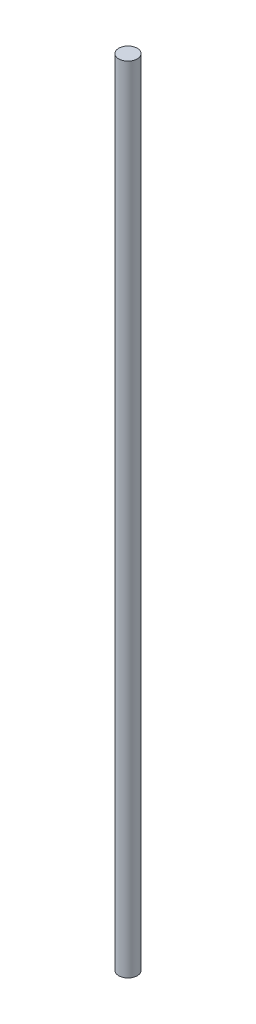
ISO-10303-21;
HEADER;
FILE_DESCRIPTION(('STEP AP214'),'2;1');
FILE_NAME('part.step','',(''),(''),'','','');
FILE_SCHEMA(('AUTOMOTIVE_DESIGN { 1 0 10303 214 1 1 1 1 }'));
ENDSEC;
DATA;
#1=APPLICATION_CONTEXT('core data for automotive mechanical design processes');
#2=APPLICATION_PROTOCOL_DEFINITION('international standard','automotive_design',2000,#1);
#3=PRODUCT_CONTEXT('',#1,'mechanical');
#4=PRODUCT('Part','Part','',(#3));
#5=PRODUCT_RELATED_PRODUCT_CATEGORY('part','',(#4));
#6=PRODUCT_DEFINITION_FORMATION('','',#4);
#7=PRODUCT_DEFINITION_CONTEXT('part definition',#1,'design');
#8=PRODUCT_DEFINITION('design','',#6,#7);
#9=PRODUCT_DEFINITION_SHAPE('','',#8);
#10=(LENGTH_UNIT() NAMED_UNIT(*) SI_UNIT(.MILLI.,.METRE.));
#11=(NAMED_UNIT(*) PLANE_ANGLE_UNIT() SI_UNIT($,.RADIAN.));
#12=(NAMED_UNIT(*) SI_UNIT($,.STERADIAN.) SOLID_ANGLE_UNIT());
#13=UNCERTAINTY_MEASURE_WITH_UNIT(LENGTH_MEASURE(1.E-05),#10,'distance_accuracy_value','');
#14=(GEOMETRIC_REPRESENTATION_CONTEXT(3) GLOBAL_UNCERTAINTY_ASSIGNED_CONTEXT((#13)) GLOBAL_UNIT_ASSIGNED_CONTEXT((#10,
#11,#12)) REPRESENTATION_CONTEXT('',''));
#15=CARTESIAN_POINT('',(0.,0.,0.));
#16=DIRECTION('',(0.,0.,1.));
#17=DIRECTION('',(1.,0.,0.));
#18=AXIS2_PLACEMENT_3D('',#15,#16,#17);
#19=CARTESIAN_POINT('',(0.,300.,0.));
#20=DIRECTION('',(0.,-1.,0.));
#21=DIRECTION('',(0.,0.,-1.));
#22=AXIS2_PLACEMENT_3D('',#19,#20,#21);
#23=CYLINDRICAL_SURFACE('',#22,3.5);
#24=CARTESIAN_POINT('',(0.,300.,0.));
#25=DIRECTION('',(0.,1.,0.));
#26=DIRECTION('',(0.,0.,1.));
#27=AXIS2_PLACEMENT_3D('',#24,#25,#26);
#28=CIRCLE('',#27,3.5);
#29=CARTESIAN_POINT('',(0.,300.,3.5));
#30=VERTEX_POINT('',#29);
#31=EDGE_CURVE('E10',#30,#30,#28,.T.);
#32=ORIENTED_EDGE('',*,*,#31,.F.);
#33=EDGE_LOOP('',(#32));
#34=FACE_BOUND('',#33,.T.);
#35=CARTESIAN_POINT('',(0.,0.,0.));
#36=DIRECTION('',(0.,1.,0.));
#37=DIRECTION('',(0.,0.,1.));
#38=AXIS2_PLACEMENT_3D('',#35,#36,#37);
#39=CIRCLE('',#38,3.5);
#40=CARTESIAN_POINT('',(0.,0.,3.5));
#41=VERTEX_POINT('',#40);
#42=EDGE_CURVE('E34',#41,#41,#39,.T.);
#43=ORIENTED_EDGE('',*,*,#42,.T.);
#44=EDGE_LOOP('',(#43));
#45=FACE_BOUND('',#44,.T.);
#46=ADVANCED_FACE('F31',(#34,#45),#23,.T.);
#47=CARTESIAN_POINT('',(0.,300.,0.));
#48=DIRECTION('',(0.,1.,0.));
#49=DIRECTION('',(0.,0.,1.));
#50=AXIS2_PLACEMENT_3D('',#47,#48,#49);
#51=PLANE('',#50);
#52=ORIENTED_EDGE('',*,*,#31,.T.);
#53=EDGE_LOOP('',(#52));
#54=FACE_BOUND('',#53,.T.);
#55=ADVANCED_FACE('F60',(#54),#51,.T.);
#56=CARTESIAN_POINT('',(0.,0.,0.));
#57=DIRECTION('',(0.,1.,0.));
#58=DIRECTION('',(0.,0.,1.));
#59=AXIS2_PLACEMENT_3D('',#56,#57,#58);
#60=PLANE('',#59);
#61=CARTESIAN_POINT('',(0.,0.,0.));
#62=DIRECTION('',(0.,-1.,0.));
#63=DIRECTION('',(0.,0.,-1.));
#64=AXIS2_PLACEMENT_3D('',#61,#62,#63);
#65=CIRCLE('',#64,2.5);
#66=CARTESIAN_POINT('',(0.,0.,-2.5));
#67=VERTEX_POINT('',#66);
#68=EDGE_CURVE('E43',#67,#67,#65,.T.);
#69=ORIENTED_EDGE('',*,*,#68,.F.);
#70=EDGE_LOOP('',(#69));
#71=FACE_BOUND('',#70,.T.);
#72=ORIENTED_EDGE('',*,*,#42,.F.);
#73=EDGE_LOOP('',(#72));
#74=FACE_BOUND('',#73,.T.);
#75=ADVANCED_FACE('F54',(#71,#74),#60,.F.);
#76=CARTESIAN_POINT('',(0.,11.,0.));
#77=DIRECTION('',(0.,-1.,0.));
#78=DIRECTION('',(0.,0.,-1.));
#79=AXIS2_PLACEMENT_3D('',#76,#77,#78);
#80=CYLINDRICAL_SURFACE('',#79,2.5);
#81=CARTESIAN_POINT('',(0.,11.,0.));
#82=DIRECTION('',(0.,-1.,0.));
#83=DIRECTION('',(0.,0.,-1.));
#84=AXIS2_PLACEMENT_3D('',#81,#82,#83);
#85=CIRCLE('',#84,2.5);
#86=CARTESIAN_POINT('',(0.,11.,-2.5));
#87=VERTEX_POINT('',#86);
#88=EDGE_CURVE('E41',#87,#87,#85,.T.);
#89=ORIENTED_EDGE('',*,*,#88,.F.);
#90=EDGE_LOOP('',(#89));
#91=FACE_BOUND('',#90,.T.);
#92=ORIENTED_EDGE('',*,*,#68,.T.);
#93=EDGE_LOOP('',(#92));
#94=FACE_BOUND('',#93,.T.);
#95=ADVANCED_FACE('F51',(#91,#94),#80,.F.);
#96=CARTESIAN_POINT('',(0.,11.,0.));
#97=DIRECTION('',(0.,-1.,0.));
#98=DIRECTION('',(0.,0.,-1.));
#99=AXIS2_PLACEMENT_3D('',#96,#97,#98);
#100=PLANE('',#99);
#101=ORIENTED_EDGE('',*,*,#88,.T.);
#102=EDGE_LOOP('',(#101));
#103=FACE_BOUND('',#102,.T.);
#104=ADVANCED_FACE('F49',(#103),#100,.T.);
#105=CLOSED_SHELL('',(#46,#55,#75,#95,#104));
#106=MANIFOLD_SOLID_BREP('B2',#105);
#107=ADVANCED_BREP_SHAPE_REPRESENTATION('',(#18,#106),#14);
#108=SHAPE_DEFINITION_REPRESENTATION(#9,#107);
ENDSEC;
END-ISO-10303-21;
